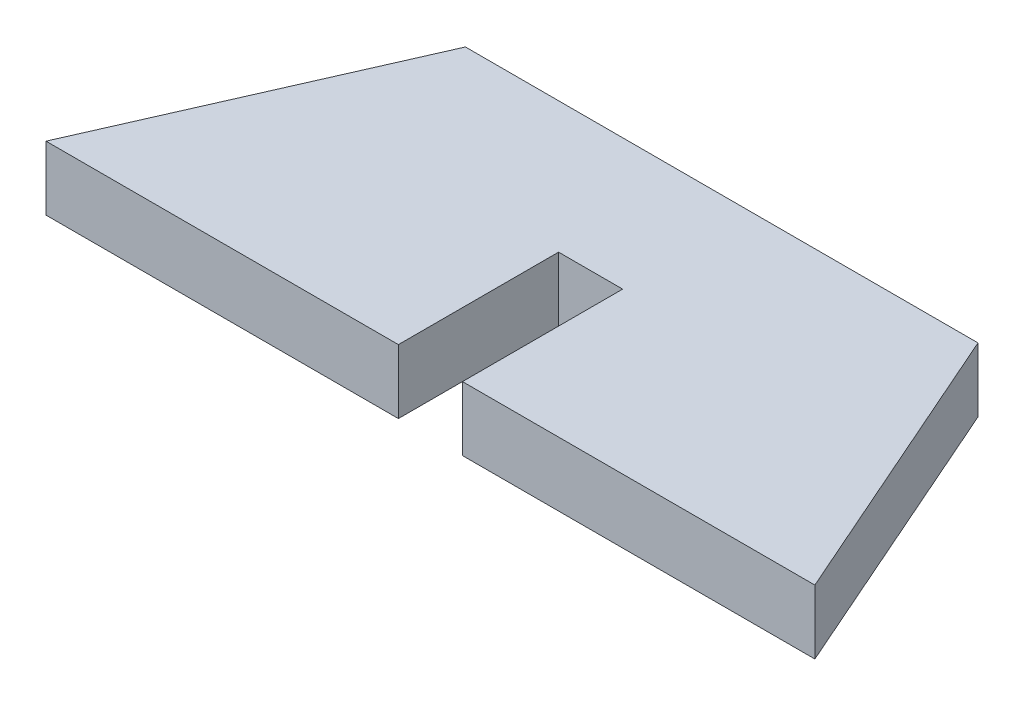
ISO-10303-21;
HEADER;
FILE_DESCRIPTION(('STEP AP214'),'2;1');
FILE_NAME('part.step','',(''),(''),'','','');
FILE_SCHEMA(('AUTOMOTIVE_DESIGN { 1 0 10303 214 1 1 1 1 }'));
ENDSEC;
DATA;
#1=APPLICATION_CONTEXT('core data for automotive mechanical design processes');
#2=APPLICATION_PROTOCOL_DEFINITION('international standard','automotive_design',2000,#1);
#3=PRODUCT_CONTEXT('',#1,'mechanical');
#4=PRODUCT('Part','Part','',(#3));
#5=PRODUCT_RELATED_PRODUCT_CATEGORY('part','',(#4));
#6=PRODUCT_DEFINITION_FORMATION('','',#4);
#7=PRODUCT_DEFINITION_CONTEXT('part definition',#1,'design');
#8=PRODUCT_DEFINITION('design','',#6,#7);
#9=PRODUCT_DEFINITION_SHAPE('','',#8);
#10=(LENGTH_UNIT() NAMED_UNIT(*) SI_UNIT(.MILLI.,.METRE.));
#11=(NAMED_UNIT(*) PLANE_ANGLE_UNIT() SI_UNIT($,.RADIAN.));
#12=(NAMED_UNIT(*) SI_UNIT($,.STERADIAN.) SOLID_ANGLE_UNIT());
#13=UNCERTAINTY_MEASURE_WITH_UNIT(LENGTH_MEASURE(1.E-05),#10,'distance_accuracy_value','');
#14=(GEOMETRIC_REPRESENTATION_CONTEXT(3) GLOBAL_UNCERTAINTY_ASSIGNED_CONTEXT((#13)) GLOBAL_UNIT_ASSIGNED_CONTEXT((#10,
#11,#12)) REPRESENTATION_CONTEXT('',''));
#15=CARTESIAN_POINT('',(0.,0.,0.));
#16=DIRECTION('',(0.,0.,1.));
#17=DIRECTION('',(1.,0.,0.));
#18=AXIS2_PLACEMENT_3D('',#15,#16,#17);
#19=CARTESIAN_POINT('',(-40.,10.,-45.4615384615385));
#20=DIRECTION('',(0.915337868411536,0.,0.402686710299491));
#21=DIRECTION('',(0.402686710299491,0.,-0.915337868411536));
#22=AXIS2_PLACEMENT_3D('',#19,#20,#21);
#23=PLANE('',#22);
#24=DIRECTION('',(-0.402686710299491,0.,0.915337868411536));
#25=VECTOR('',#24,1.);
#26=CARTESIAN_POINT('',(-40.,0.,-45.4615384615385));
#27=LINE('',#26,#25);
#28=CARTESIAN_POINT('',(-40.,0.,-45.4615384615385));
#29=VERTEX_POINT('',#28);
#30=CARTESIAN_POINT('',(-60.,0.,0.));
#31=VERTEX_POINT('',#30);
#32=EDGE_CURVE('E133',#29,#31,#27,.T.);
#33=ORIENTED_EDGE('',*,*,#32,.T.);
#34=DIRECTION('',(0.,-1.,0.));
#35=VECTOR('',#34,1.);
#36=CARTESIAN_POINT('',(-60.,10.,0.));
#37=LINE('',#36,#35);
#38=CARTESIAN_POINT('',(-60.,10.,0.));
#39=VERTEX_POINT('',#38);
#40=EDGE_CURVE('E11',#39,#31,#37,.T.);
#41=ORIENTED_EDGE('',*,*,#40,.F.);
#42=DIRECTION('',(-0.402686710299491,0.,0.915337868411536));
#43=VECTOR('',#42,1.);
#44=CARTESIAN_POINT('',(-40.,10.,-45.4615384615385));
#45=LINE('',#44,#43);
#46=CARTESIAN_POINT('',(-40.,10.,-45.4615384615385));
#47=VERTEX_POINT('',#46);
#48=EDGE_CURVE('E147',#47,#39,#45,.T.);
#49=ORIENTED_EDGE('',*,*,#48,.F.);
#50=DIRECTION('',(0.,-1.,0.));
#51=VECTOR('',#50,1.);
#52=CARTESIAN_POINT('',(-40.,10.,-45.4615384615385));
#53=LINE('',#52,#51);
#54=EDGE_CURVE('E129',#47,#29,#53,.T.);
#55=ORIENTED_EDGE('',*,*,#54,.T.);
#56=EDGE_LOOP('',(#33,#41,#49,#55));
#57=FACE_BOUND('',#56,.T.);
#58=ADVANCED_FACE('F37',(#57),#23,.F.);
#59=CARTESIAN_POINT('',(-60.,10.,0.));
#60=DIRECTION('',(0.,0.,-1.));
#61=DIRECTION('',(-1.,0.,0.));
#62=AXIS2_PLACEMENT_3D('',#59,#60,#61);
#63=PLANE('',#62);
#64=DIRECTION('',(1.,0.,0.));
#65=VECTOR('',#64,1.);
#66=CARTESIAN_POINT('',(-60.,0.,0.));
#67=LINE('',#66,#65);
#68=CARTESIAN_POINT('',(-5.,0.,0.));
#69=VERTEX_POINT('',#68);
#70=EDGE_CURVE('E136',#31,#69,#67,.T.);
#71=ORIENTED_EDGE('',*,*,#70,.T.);
#72=DIRECTION('',(0.,-1.,0.));
#73=VECTOR('',#72,1.);
#74=CARTESIAN_POINT('',(-5.,10.,0.));
#75=LINE('',#74,#73);
#76=CARTESIAN_POINT('',(-5.,10.,0.));
#77=VERTEX_POINT('',#76);
#78=EDGE_CURVE('E45',#77,#69,#75,.T.);
#79=ORIENTED_EDGE('',*,*,#78,.F.);
#80=DIRECTION('',(1.,0.,0.));
#81=VECTOR('',#80,1.);
#82=CARTESIAN_POINT('',(-60.,10.,0.));
#83=LINE('',#82,#81);
#84=EDGE_CURVE('E96',#39,#77,#83,.T.);
#85=ORIENTED_EDGE('',*,*,#84,.F.);
#86=ORIENTED_EDGE('',*,*,#40,.T.);
#87=EDGE_LOOP('',(#71,#79,#85,#86));
#88=FACE_BOUND('',#87,.T.);
#89=ADVANCED_FACE('F182',(#88),#63,.F.);
#90=CARTESIAN_POINT('',(-5.,10.,0.));
#91=DIRECTION('',(-1.,0.,0.));
#92=DIRECTION('',(0.,0.,1.));
#93=AXIS2_PLACEMENT_3D('',#90,#91,#92);
#94=PLANE('',#93);
#95=DIRECTION('',(0.,0.,-1.));
#96=VECTOR('',#95,1.);
#97=CARTESIAN_POINT('',(-5.,0.,0.));
#98=LINE('',#97,#96);
#99=CARTESIAN_POINT('',(-5.,0.,-25.));
#100=VERTEX_POINT('',#99);
#101=EDGE_CURVE('E138',#69,#100,#98,.T.);
#102=ORIENTED_EDGE('',*,*,#101,.T.);
#103=DIRECTION('',(0.,-1.,0.));
#104=VECTOR('',#103,1.);
#105=CARTESIAN_POINT('',(-5.,10.,-25.));
#106=LINE('',#105,#104);
#107=CARTESIAN_POINT('',(-5.,10.,-25.));
#108=VERTEX_POINT('',#107);
#109=EDGE_CURVE('E154',#108,#100,#106,.T.);
#110=ORIENTED_EDGE('',*,*,#109,.F.);
#111=DIRECTION('',(0.,0.,-1.));
#112=VECTOR('',#111,1.);
#113=CARTESIAN_POINT('',(-5.,10.,0.));
#114=LINE('',#113,#112);
#115=EDGE_CURVE('E162',#77,#108,#114,.T.);
#116=ORIENTED_EDGE('',*,*,#115,.F.);
#117=ORIENTED_EDGE('',*,*,#78,.T.);
#118=EDGE_LOOP('',(#102,#110,#116,#117));
#119=FACE_BOUND('',#118,.T.);
#120=ADVANCED_FACE('F160',(#119),#94,.F.);
#121=CARTESIAN_POINT('',(5.,10.,-25.));
#122=DIRECTION('',(0.,0.,-1.));
#123=DIRECTION('',(-1.,0.,0.));
#124=AXIS2_PLACEMENT_3D('',#121,#122,#123);
#125=PLANE('',#124);
#126=DIRECTION('',(1.,0.,0.));
#127=VECTOR('',#126,1.);
#128=CARTESIAN_POINT('',(5.,0.,-25.));
#129=LINE('',#128,#127);
#130=CARTESIAN_POINT('',(5.,0.,-25.));
#131=VERTEX_POINT('',#130);
#132=EDGE_CURVE('E140',#100,#131,#129,.T.);
#133=ORIENTED_EDGE('',*,*,#132,.T.);
#134=DIRECTION('',(0.,-1.,0.));
#135=VECTOR('',#134,1.);
#136=CARTESIAN_POINT('',(5.,10.,-25.));
#137=LINE('',#136,#135);
#138=CARTESIAN_POINT('',(5.,10.,-25.));
#139=VERTEX_POINT('',#138);
#140=EDGE_CURVE('E151',#139,#131,#137,.T.);
#141=ORIENTED_EDGE('',*,*,#140,.F.);
#142=DIRECTION('',(1.,0.,0.));
#143=VECTOR('',#142,1.);
#144=CARTESIAN_POINT('',(5.,10.,-25.));
#145=LINE('',#144,#143);
#146=EDGE_CURVE('E174',#108,#139,#145,.T.);
#147=ORIENTED_EDGE('',*,*,#146,.F.);
#148=ORIENTED_EDGE('',*,*,#109,.T.);
#149=EDGE_LOOP('',(#133,#141,#147,#148));
#150=FACE_BOUND('',#149,.T.);
#151=ADVANCED_FACE('F170',(#150),#125,.F.);
#152=CARTESIAN_POINT('',(5.,10.,0.));
#153=DIRECTION('',(1.,0.,0.));
#154=DIRECTION('',(0.,0.,-1.));
#155=AXIS2_PLACEMENT_3D('',#152,#153,#154);
#156=PLANE('',#155);
#157=DIRECTION('',(0.,0.,1.));
#158=VECTOR('',#157,1.);
#159=CARTESIAN_POINT('',(5.,0.,0.));
#160=LINE('',#159,#158);
#161=CARTESIAN_POINT('',(5.,0.,0.));
#162=VERTEX_POINT('',#161);
#163=EDGE_CURVE('E142',#131,#162,#160,.T.);
#164=ORIENTED_EDGE('',*,*,#163,.T.);
#165=DIRECTION('',(0.,-1.,0.));
#166=VECTOR('',#165,1.);
#167=CARTESIAN_POINT('',(5.,10.,0.));
#168=LINE('',#167,#166);
#169=CARTESIAN_POINT('',(5.,10.,0.));
#170=VERTEX_POINT('',#169);
#171=EDGE_CURVE('E124',#170,#162,#168,.T.);
#172=ORIENTED_EDGE('',*,*,#171,.F.);
#173=DIRECTION('',(0.,0.,1.));
#174=VECTOR('',#173,1.);
#175=CARTESIAN_POINT('',(5.,10.,0.));
#176=LINE('',#175,#174);
#177=EDGE_CURVE('E115',#139,#170,#176,.T.);
#178=ORIENTED_EDGE('',*,*,#177,.F.);
#179=ORIENTED_EDGE('',*,*,#140,.T.);
#180=EDGE_LOOP('',(#164,#172,#178,#179));
#181=FACE_BOUND('',#180,.T.);
#182=ADVANCED_FACE('F173',(#181),#156,.F.);
#183=CARTESIAN_POINT('',(5.,10.,0.));
#184=DIRECTION('',(0.,0.,-1.));
#185=DIRECTION('',(-1.,0.,0.));
#186=AXIS2_PLACEMENT_3D('',#183,#184,#185);
#187=PLANE('',#186);
#188=DIRECTION('',(1.,0.,0.));
#189=VECTOR('',#188,1.);
#190=CARTESIAN_POINT('',(5.,0.,0.));
#191=LINE('',#190,#189);
#192=CARTESIAN_POINT('',(60.,0.,0.));
#193=VERTEX_POINT('',#192);
#194=EDGE_CURVE('E123',#162,#193,#191,.T.);
#195=ORIENTED_EDGE('',*,*,#194,.T.);
#196=DIRECTION('',(0.,-1.,0.));
#197=VECTOR('',#196,1.);
#198=CARTESIAN_POINT('',(60.,10.,0.));
#199=LINE('',#198,#197);
#200=CARTESIAN_POINT('',(60.,10.,0.));
#201=VERTEX_POINT('',#200);
#202=EDGE_CURVE('E120',#201,#193,#199,.T.);
#203=ORIENTED_EDGE('',*,*,#202,.F.);
#204=DIRECTION('',(1.,0.,0.));
#205=VECTOR('',#204,1.);
#206=CARTESIAN_POINT('',(5.,10.,0.));
#207=LINE('',#206,#205);
#208=EDGE_CURVE('E109',#170,#201,#207,.T.);
#209=ORIENTED_EDGE('',*,*,#208,.F.);
#210=ORIENTED_EDGE('',*,*,#171,.T.);
#211=EDGE_LOOP('',(#195,#203,#209,#210));
#212=FACE_BOUND('',#211,.T.);
#213=ADVANCED_FACE('F121',(#212),#187,.F.);
#214=CARTESIAN_POINT('',(60.,10.,0.));
#215=DIRECTION('',(-0.915337868411536,0.,0.402686710299491));
#216=DIRECTION('',(0.402686710299491,0.,0.915337868411536));
#217=AXIS2_PLACEMENT_3D('',#214,#215,#216);
#218=PLANE('',#217);
#219=DIRECTION('',(-0.402686710299491,0.,-0.915337868411536));
#220=VECTOR('',#219,1.);
#221=CARTESIAN_POINT('',(60.,0.,0.));
#222=LINE('',#221,#220);
#223=CARTESIAN_POINT('',(40.,0.,-45.4615384615385));
#224=VERTEX_POINT('',#223);
#225=EDGE_CURVE('E82',#193,#224,#222,.T.);
#226=ORIENTED_EDGE('',*,*,#225,.T.);
#227=DIRECTION('',(0.,-1.,0.));
#228=VECTOR('',#227,1.);
#229=CARTESIAN_POINT('',(40.,10.,-45.4615384615385));
#230=LINE('',#229,#228);
#231=CARTESIAN_POINT('',(40.,10.,-45.4615384615385));
#232=VERTEX_POINT('',#231);
#233=EDGE_CURVE('E125',#232,#224,#230,.T.);
#234=ORIENTED_EDGE('',*,*,#233,.F.);
#235=DIRECTION('',(-0.402686710299491,0.,-0.915337868411536));
#236=VECTOR('',#235,1.);
#237=CARTESIAN_POINT('',(60.,10.,0.));
#238=LINE('',#237,#236);
#239=EDGE_CURVE('E113',#201,#232,#238,.T.);
#240=ORIENTED_EDGE('',*,*,#239,.F.);
#241=ORIENTED_EDGE('',*,*,#202,.T.);
#242=EDGE_LOOP('',(#226,#234,#240,#241));
#243=FACE_BOUND('',#242,.T.);
#244=ADVANCED_FACE('F127',(#243),#218,.F.);
#245=CARTESIAN_POINT('',(-40.,10.,-45.4615384615385));
#246=DIRECTION('',(0.,0.,1.));
#247=DIRECTION('',(1.,0.,0.));
#248=AXIS2_PLACEMENT_3D('',#245,#246,#247);
#249=PLANE('',#248);
#250=DIRECTION('',(-1.,0.,0.));
#251=VECTOR('',#250,1.);
#252=CARTESIAN_POINT('',(-40.,0.,-45.4615384615385));
#253=LINE('',#252,#251);
#254=EDGE_CURVE('E88',#224,#29,#253,.T.);
#255=ORIENTED_EDGE('',*,*,#254,.T.);
#256=ORIENTED_EDGE('',*,*,#54,.F.);
#257=DIRECTION('',(-1.,0.,0.));
#258=VECTOR('',#257,1.);
#259=CARTESIAN_POINT('',(-40.,10.,-45.4615384615385));
#260=LINE('',#259,#258);
#261=EDGE_CURVE('E53',#232,#47,#260,.T.);
#262=ORIENTED_EDGE('',*,*,#261,.F.);
#263=ORIENTED_EDGE('',*,*,#233,.T.);
#264=EDGE_LOOP('',(#255,#256,#262,#263));
#265=FACE_BOUND('',#264,.T.);
#266=ADVANCED_FACE('F198',(#265),#249,.F.);
#267=CARTESIAN_POINT('',(0.,10.,0.));
#268=DIRECTION('',(0.,1.,0.));
#269=DIRECTION('',(0.,0.,1.));
#270=AXIS2_PLACEMENT_3D('',#267,#268,#269);
#271=PLANE('',#270);
#272=ORIENTED_EDGE('',*,*,#48,.T.);
#273=ORIENTED_EDGE('',*,*,#84,.T.);
#274=ORIENTED_EDGE('',*,*,#115,.T.);
#275=ORIENTED_EDGE('',*,*,#146,.T.);
#276=ORIENTED_EDGE('',*,*,#177,.T.);
#277=ORIENTED_EDGE('',*,*,#208,.T.);
#278=ORIENTED_EDGE('',*,*,#239,.T.);
#279=ORIENTED_EDGE('',*,*,#261,.T.);
#280=EDGE_LOOP('',(#272,#273,#274,#275,#276,#277,#278,#279));
#281=FACE_BOUND('',#280,.T.);
#282=ADVANCED_FACE('F111',(#281),#271,.T.);
#283=CARTESIAN_POINT('',(0.,0.,0.));
#284=DIRECTION('',(0.,1.,0.));
#285=DIRECTION('',(0.,0.,1.));
#286=AXIS2_PLACEMENT_3D('',#283,#284,#285);
#287=PLANE('',#286);
#288=ORIENTED_EDGE('',*,*,#32,.F.);
#289=ORIENTED_EDGE('',*,*,#254,.F.);
#290=ORIENTED_EDGE('',*,*,#225,.F.);
#291=ORIENTED_EDGE('',*,*,#194,.F.);
#292=ORIENTED_EDGE('',*,*,#163,.F.);
#293=ORIENTED_EDGE('',*,*,#132,.F.);
#294=ORIENTED_EDGE('',*,*,#101,.F.);
#295=ORIENTED_EDGE('',*,*,#70,.F.);
#296=EDGE_LOOP('',(#288,#289,#290,#291,#292,#293,#294,#295));
#297=FACE_BOUND('',#296,.T.);
#298=ADVANCED_FACE('F166',(#297),#287,.F.);
#299=CLOSED_SHELL('',(#58,#89,#120,#151,#182,#213,#244,#266,#282,#298));
#300=MANIFOLD_SOLID_BREP('B2',#299);
#301=ADVANCED_BREP_SHAPE_REPRESENTATION('',(#18,#300),#14);
#302=SHAPE_DEFINITION_REPRESENTATION(#9,#301);
ENDSEC;
END-ISO-10303-21;
